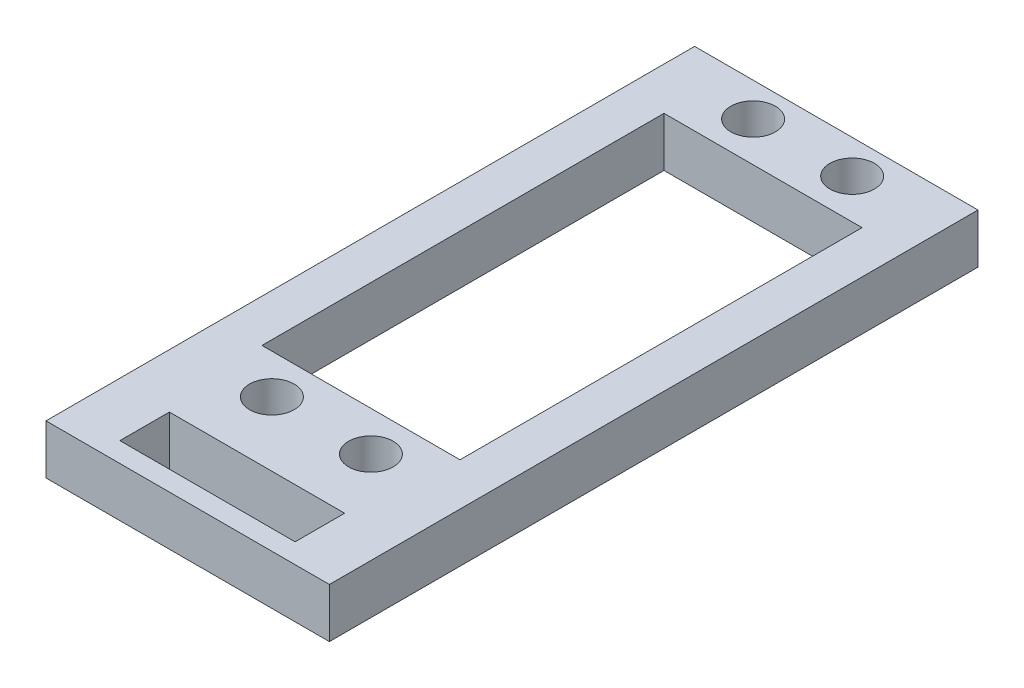
ISO-10303-21;
HEADER;
FILE_DESCRIPTION(('STEP AP214'),'2;1');
FILE_NAME('part.step','',(''),(''),'','','');
FILE_SCHEMA(('AUTOMOTIVE_DESIGN { 1 0 10303 214 1 1 1 1 }'));
ENDSEC;
DATA;
#1=APPLICATION_CONTEXT('core data for automotive mechanical design processes');
#2=APPLICATION_PROTOCOL_DEFINITION('international standard','automotive_design',2000,#1);
#3=PRODUCT_CONTEXT('',#1,'mechanical');
#4=PRODUCT('Part','Part','',(#3));
#5=PRODUCT_RELATED_PRODUCT_CATEGORY('part','',(#4));
#6=PRODUCT_DEFINITION_FORMATION('','',#4);
#7=PRODUCT_DEFINITION_CONTEXT('part definition',#1,'design');
#8=PRODUCT_DEFINITION('design','',#6,#7);
#9=PRODUCT_DEFINITION_SHAPE('','',#8);
#10=(LENGTH_UNIT() NAMED_UNIT(*) SI_UNIT(.MILLI.,.METRE.));
#11=(NAMED_UNIT(*) PLANE_ANGLE_UNIT() SI_UNIT($,.RADIAN.));
#12=(NAMED_UNIT(*) SI_UNIT($,.STERADIAN.) SOLID_ANGLE_UNIT());
#13=UNCERTAINTY_MEASURE_WITH_UNIT(LENGTH_MEASURE(1.E-05),#10,'distance_accuracy_value','');
#14=(GEOMETRIC_REPRESENTATION_CONTEXT(3) GLOBAL_UNCERTAINTY_ASSIGNED_CONTEXT((#13)) GLOBAL_UNIT_ASSIGNED_CONTEXT((#10,
#11,#12)) REPRESENTATION_CONTEXT('',''));
#15=CARTESIAN_POINT('',(0.,0.,0.));
#16=DIRECTION('',(0.,0.,1.));
#17=DIRECTION('',(1.,0.,0.));
#18=AXIS2_PLACEMENT_3D('',#15,#16,#17);
#19=CARTESIAN_POINT('',(0.,5.,0.));
#20=DIRECTION('',(0.,-1.,0.));
#21=DIRECTION('',(0.,0.,-1.));
#22=AXIS2_PLACEMENT_3D('',#19,#20,#21);
#23=PLANE('',#22);
#24=DIRECTION('',(0.,0.,1.));
#25=VECTOR('',#24,1.);
#26=CARTESIAN_POINT('',(0.,5.,0.));
#27=LINE('',#26,#25);
#28=CARTESIAN_POINT('',(0.,5.,0.));
#29=VERTEX_POINT('',#28);
#30=CARTESIAN_POINT('',(0.,5.,40.6));
#31=VERTEX_POINT('',#30);
#32=EDGE_CURVE('E161',#29,#31,#27,.T.);
#33=ORIENTED_EDGE('',*,*,#32,.F.);
#34=DIRECTION('',(-1.,0.,0.));
#35=VECTOR('',#34,1.);
#36=CARTESIAN_POINT('',(0.,5.,0.));
#37=LINE('',#36,#35);
#38=CARTESIAN_POINT('',(20.,5.,0.));
#39=VERTEX_POINT('',#38);
#40=EDGE_CURVE('E169',#39,#29,#37,.T.);
#41=ORIENTED_EDGE('',*,*,#40,.F.);
#42=DIRECTION('',(0.,0.,-1.));
#43=VECTOR('',#42,1.);
#44=CARTESIAN_POINT('',(20.,5.,0.));
#45=LINE('',#44,#43);
#46=CARTESIAN_POINT('',(20.,5.,40.6));
#47=VERTEX_POINT('',#46);
#48=EDGE_CURVE('E166',#47,#39,#45,.T.);
#49=ORIENTED_EDGE('',*,*,#48,.F.);
#50=DIRECTION('',(1.,0.,0.));
#51=VECTOR('',#50,1.);
#52=CARTESIAN_POINT('',(0.,5.,40.6));
#53=LINE('',#52,#51);
#54=EDGE_CURVE('E163',#31,#47,#53,.T.);
#55=ORIENTED_EDGE('',*,*,#54,.F.);
#56=EDGE_LOOP('',(#33,#41,#49,#55));
#57=FACE_BOUND('',#56,.T.);
#58=DIRECTION('',(0.,0.,-1.));
#59=VECTOR('',#58,1.);
#60=CARTESIAN_POINT('',(24.3088782061078,5.,48.));
#61=LINE('',#60,#59);
#62=CARTESIAN_POINT('',(24.3088782061078,5.,58.1));
#63=VERTEX_POINT('',#62);
#64=CARTESIAN_POINT('',(24.3088782061078,5.,-7.4));
#65=VERTEX_POINT('',#64);
#66=EDGE_CURVE('E192',#63,#65,#61,.T.);
#67=ORIENTED_EDGE('',*,*,#66,.T.);
#68=DIRECTION('',(-1.,0.,0.));
#69=VECTOR('',#68,1.);
#70=CARTESIAN_POINT('',(-4.30887820610779,5.,-7.4));
#71=LINE('',#70,#69);
#72=CARTESIAN_POINT('',(-4.30887820610779,5.,-7.4));
#73=VERTEX_POINT('',#72);
#74=EDGE_CURVE('E195',#65,#73,#71,.T.);
#75=ORIENTED_EDGE('',*,*,#74,.T.);
#76=DIRECTION('',(0.,0.,1.));
#77=VECTOR('',#76,1.);
#78=CARTESIAN_POINT('',(-4.30887820610779,5.,48.));
#79=LINE('',#78,#77);
#80=CARTESIAN_POINT('',(-4.30887820610779,5.,58.1));
#81=VERTEX_POINT('',#80);
#82=EDGE_CURVE('E198',#73,#81,#79,.T.);
#83=ORIENTED_EDGE('',*,*,#82,.T.);
#84=DIRECTION('',(1.,0.,0.));
#85=VECTOR('',#84,1.);
#86=CARTESIAN_POINT('',(-4.30887820610779,5.,58.1));
#87=LINE('',#86,#85);
#88=EDGE_CURVE('E200',#81,#63,#87,.T.);
#89=ORIENTED_EDGE('',*,*,#88,.T.);
#90=EDGE_LOOP('',(#67,#75,#83,#89));
#91=FACE_BOUND('',#90,.T.);
#92=DIRECTION('',(0.,0.,-1.));
#93=VECTOR('',#92,1.);
#94=CARTESIAN_POINT('',(18.848117925688,5.,56.1));
#95=LINE('',#94,#93);
#96=CARTESIAN_POINT('',(18.848117925688,5.,56.1));
#97=VERTEX_POINT('',#96);
#98=CARTESIAN_POINT('',(18.848117925688,5.,51.1));
#99=VERTEX_POINT('',#98);
#100=EDGE_CURVE('E122',#97,#99,#95,.T.);
#101=ORIENTED_EDGE('',*,*,#100,.F.);
#102=DIRECTION('',(1.,0.,0.));
#103=VECTOR('',#102,1.);
#104=CARTESIAN_POINT('',(1.15188207431199,5.,56.1));
#105=LINE('',#104,#103);
#106=CARTESIAN_POINT('',(1.15188207431199,5.,56.1));
#107=VERTEX_POINT('',#106);
#108=EDGE_CURVE('E145',#107,#97,#105,.T.);
#109=ORIENTED_EDGE('',*,*,#108,.F.);
#110=DIRECTION('',(0.,0.,1.));
#111=VECTOR('',#110,1.);
#112=CARTESIAN_POINT('',(1.15188207431199,5.,56.1));
#113=LINE('',#112,#111);
#114=CARTESIAN_POINT('',(1.15188207431199,5.,51.1));
#115=VERTEX_POINT('',#114);
#116=EDGE_CURVE('E143',#115,#107,#113,.T.);
#117=ORIENTED_EDGE('',*,*,#116,.F.);
#118=DIRECTION('',(-1.,0.,0.));
#119=VECTOR('',#118,1.);
#120=CARTESIAN_POINT('',(1.15188207431199,5.,51.1));
#121=LINE('',#120,#119);
#122=EDGE_CURVE('E130',#99,#115,#121,.T.);
#123=ORIENTED_EDGE('',*,*,#122,.F.);
#124=EDGE_LOOP('',(#101,#109,#117,#123));
#125=FACE_BOUND('',#124,.T.);
#126=CARTESIAN_POINT('',(5.,5.,-3.99999999999999));
#127=DIRECTION('',(0.,1.,0.));
#128=DIRECTION('',(0.,0.,1.));
#129=AXIS2_PLACEMENT_3D('',#126,#127,#128);
#130=CIRCLE('',#129,2.25);
#131=CARTESIAN_POINT('',(5.,5.,-1.74999999999999));
#132=VERTEX_POINT('',#131);
#133=EDGE_CURVE('E151',#132,#132,#130,.T.);
#134=ORIENTED_EDGE('',*,*,#133,.F.);
#135=EDGE_LOOP('',(#134));
#136=FACE_BOUND('',#135,.T.);
#137=CARTESIAN_POINT('',(15.,5.,-3.99999999999999));
#138=DIRECTION('',(0.,1.,0.));
#139=DIRECTION('',(0.,0.,-1.));
#140=AXIS2_PLACEMENT_3D('',#137,#138,#139);
#141=CIRCLE('',#140,2.25);
#142=CARTESIAN_POINT('',(15.,5.,-6.25));
#143=VERTEX_POINT('',#142);
#144=EDGE_CURVE('E424',#143,#143,#141,.T.);
#145=ORIENTED_EDGE('',*,*,#144,.F.);
#146=EDGE_LOOP('',(#145));
#147=FACE_BOUND('',#146,.T.);
#148=CARTESIAN_POINT('',(5.00000000000001,5.,44.6));
#149=DIRECTION('',(0.,1.,0.));
#150=DIRECTION('',(0.,0.,-1.));
#151=AXIS2_PLACEMENT_3D('',#148,#149,#150);
#152=CIRCLE('',#151,2.25);
#153=CARTESIAN_POINT('',(5.00000000000001,5.,42.35));
#154=VERTEX_POINT('',#153);
#155=EDGE_CURVE('E418',#154,#154,#152,.T.);
#156=ORIENTED_EDGE('',*,*,#155,.F.);
#157=EDGE_LOOP('',(#156));
#158=FACE_BOUND('',#157,.T.);
#159=CARTESIAN_POINT('',(15.,5.,44.6));
#160=DIRECTION('',(0.,1.,0.));
#161=DIRECTION('',(0.,0.,1.));
#162=AXIS2_PLACEMENT_3D('',#159,#160,#161);
#163=CIRCLE('',#162,2.25000000000001);
#164=CARTESIAN_POINT('',(15.,5.,46.85));
#165=VERTEX_POINT('',#164);
#166=EDGE_CURVE('E409',#165,#165,#163,.T.);
#167=ORIENTED_EDGE('',*,*,#166,.F.);
#168=EDGE_LOOP('',(#167));
#169=FACE_BOUND('',#168,.T.);
#170=ADVANCED_FACE('F33',(#57,#91,#125,#136,#147,#158,#169),#23,.F.);
#171=CARTESIAN_POINT('',(0.,0.,0.));
#172=DIRECTION('',(0.,-1.,0.));
#173=DIRECTION('',(0.,0.,-1.));
#174=AXIS2_PLACEMENT_3D('',#171,#172,#173);
#175=PLANE('',#174);
#176=CARTESIAN_POINT('',(5.00000000000001,0.,44.6));
#177=DIRECTION('',(0.,1.,0.));
#178=DIRECTION('',(0.,0.,-1.));
#179=AXIS2_PLACEMENT_3D('',#176,#177,#178);
#180=CIRCLE('',#179,2.25);
#181=CARTESIAN_POINT('',(5.00000000000001,0.,42.35));
#182=VERTEX_POINT('',#181);
#183=EDGE_CURVE('E415',#182,#182,#180,.T.);
#184=ORIENTED_EDGE('',*,*,#183,.T.);
#185=EDGE_LOOP('',(#184));
#186=FACE_BOUND('',#185,.T.);
#187=CARTESIAN_POINT('',(5.,0.,-3.99999999999999));
#188=DIRECTION('',(0.,1.,0.));
#189=DIRECTION('',(0.,0.,1.));
#190=AXIS2_PLACEMENT_3D('',#187,#188,#189);
#191=CIRCLE('',#190,2.25);
#192=CARTESIAN_POINT('',(5.,0.,-1.74999999999999));
#193=VERTEX_POINT('',#192);
#194=EDGE_CURVE('E427',#193,#193,#191,.T.);
#195=ORIENTED_EDGE('',*,*,#194,.T.);
#196=EDGE_LOOP('',(#195));
#197=FACE_BOUND('',#196,.T.);
#198=DIRECTION('',(-1.,0.,0.));
#199=VECTOR('',#198,1.);
#200=CARTESIAN_POINT('',(-4.30887820610779,0.,-7.4));
#201=LINE('',#200,#199);
#202=CARTESIAN_POINT('',(24.3088782061078,0.,-7.4));
#203=VERTEX_POINT('',#202);
#204=CARTESIAN_POINT('',(-4.30887820610779,0.,-7.4));
#205=VERTEX_POINT('',#204);
#206=EDGE_CURVE('E191',#203,#205,#201,.T.);
#207=ORIENTED_EDGE('',*,*,#206,.F.);
#208=DIRECTION('',(0.,0.,-1.));
#209=VECTOR('',#208,1.);
#210=CARTESIAN_POINT('',(24.3088782061078,0.,48.));
#211=LINE('',#210,#209);
#212=CARTESIAN_POINT('',(24.3088782061078,0.,58.1));
#213=VERTEX_POINT('',#212);
#214=EDGE_CURVE('E196',#213,#203,#211,.T.);
#215=ORIENTED_EDGE('',*,*,#214,.F.);
#216=DIRECTION('',(1.,0.,0.));
#217=VECTOR('',#216,1.);
#218=CARTESIAN_POINT('',(-4.30887820610779,0.,58.1));
#219=LINE('',#218,#217);
#220=CARTESIAN_POINT('',(-4.30887820610779,0.,58.1));
#221=VERTEX_POINT('',#220);
#222=EDGE_CURVE('E208',#221,#213,#219,.T.);
#223=ORIENTED_EDGE('',*,*,#222,.F.);
#224=DIRECTION('',(0.,0.,1.));
#225=VECTOR('',#224,1.);
#226=CARTESIAN_POINT('',(-4.30887820610779,0.,48.));
#227=LINE('',#226,#225);
#228=EDGE_CURVE('E206',#205,#221,#227,.T.);
#229=ORIENTED_EDGE('',*,*,#228,.F.);
#230=EDGE_LOOP('',(#207,#215,#223,#229));
#231=FACE_BOUND('',#230,.T.);
#232=DIRECTION('',(-1.,0.,0.));
#233=VECTOR('',#232,1.);
#234=CARTESIAN_POINT('',(0.,0.,0.));
#235=LINE('',#234,#233);
#236=CARTESIAN_POINT('',(20.,0.,0.));
#237=VERTEX_POINT('',#236);
#238=CARTESIAN_POINT('',(0.,0.,0.));
#239=VERTEX_POINT('',#238);
#240=EDGE_CURVE('E164',#237,#239,#235,.T.);
#241=ORIENTED_EDGE('',*,*,#240,.T.);
#242=DIRECTION('',(0.,0.,1.));
#243=VECTOR('',#242,1.);
#244=CARTESIAN_POINT('',(0.,0.,0.));
#245=LINE('',#244,#243);
#246=CARTESIAN_POINT('',(0.,0.,40.6));
#247=VERTEX_POINT('',#246);
#248=EDGE_CURVE('E138',#239,#247,#245,.T.);
#249=ORIENTED_EDGE('',*,*,#248,.T.);
#250=DIRECTION('',(1.,0.,0.));
#251=VECTOR('',#250,1.);
#252=CARTESIAN_POINT('',(0.,0.,40.6));
#253=LINE('',#252,#251);
#254=CARTESIAN_POINT('',(20.,0.,40.6));
#255=VERTEX_POINT('',#254);
#256=EDGE_CURVE('E174',#247,#255,#253,.T.);
#257=ORIENTED_EDGE('',*,*,#256,.T.);
#258=DIRECTION('',(0.,0.,-1.));
#259=VECTOR('',#258,1.);
#260=CARTESIAN_POINT('',(20.,0.,0.));
#261=LINE('',#260,#259);
#262=EDGE_CURVE('E177',#255,#237,#261,.T.);
#263=ORIENTED_EDGE('',*,*,#262,.T.);
#264=EDGE_LOOP('',(#241,#249,#257,#263));
#265=FACE_BOUND('',#264,.T.);
#266=DIRECTION('',(1.,0.,0.));
#267=VECTOR('',#266,1.);
#268=CARTESIAN_POINT('',(1.15188207431199,0.,56.1));
#269=LINE('',#268,#267);
#270=CARTESIAN_POINT('',(1.15188207431199,0.,56.1));
#271=VERTEX_POINT('',#270);
#272=CARTESIAN_POINT('',(18.848117925688,0.,56.1));
#273=VERTEX_POINT('',#272);
#274=EDGE_CURVE('E131',#271,#273,#269,.T.);
#275=ORIENTED_EDGE('',*,*,#274,.T.);
#276=DIRECTION('',(0.,0.,-1.));
#277=VECTOR('',#276,1.);
#278=CARTESIAN_POINT('',(18.848117925688,0.,56.1));
#279=LINE('',#278,#277);
#280=CARTESIAN_POINT('',(18.848117925688,0.,51.1));
#281=VERTEX_POINT('',#280);
#282=EDGE_CURVE('E56',#273,#281,#279,.T.);
#283=ORIENTED_EDGE('',*,*,#282,.T.);
#284=DIRECTION('',(-1.,0.,0.));
#285=VECTOR('',#284,1.);
#286=CARTESIAN_POINT('',(1.15188207431199,0.,51.1));
#287=LINE('',#286,#285);
#288=CARTESIAN_POINT('',(1.15188207431199,0.,51.1));
#289=VERTEX_POINT('',#288);
#290=EDGE_CURVE('E137',#281,#289,#287,.T.);
#291=ORIENTED_EDGE('',*,*,#290,.T.);
#292=DIRECTION('',(0.,0.,1.));
#293=VECTOR('',#292,1.);
#294=CARTESIAN_POINT('',(1.15188207431199,0.,56.1));
#295=LINE('',#294,#293);
#296=EDGE_CURVE('E153',#289,#271,#295,.T.);
#297=ORIENTED_EDGE('',*,*,#296,.T.);
#298=EDGE_LOOP('',(#275,#283,#291,#297));
#299=FACE_BOUND('',#298,.T.);
#300=CARTESIAN_POINT('',(15.,0.,-3.99999999999999));
#301=DIRECTION('',(0.,1.,0.));
#302=DIRECTION('',(0.,0.,-1.));
#303=AXIS2_PLACEMENT_3D('',#300,#301,#302);
#304=CIRCLE('',#303,2.25);
#305=CARTESIAN_POINT('',(15.,0.,-6.25));
#306=VERTEX_POINT('',#305);
#307=EDGE_CURVE('E421',#306,#306,#304,.T.);
#308=ORIENTED_EDGE('',*,*,#307,.T.);
#309=EDGE_LOOP('',(#308));
#310=FACE_BOUND('',#309,.T.);
#311=CARTESIAN_POINT('',(15.,0.,44.6));
#312=DIRECTION('',(0.,1.,0.));
#313=DIRECTION('',(0.,0.,1.));
#314=AXIS2_PLACEMENT_3D('',#311,#312,#313);
#315=CIRCLE('',#314,2.25000000000001);
#316=CARTESIAN_POINT('',(15.,0.,46.85));
#317=VERTEX_POINT('',#316);
#318=EDGE_CURVE('E412',#317,#317,#315,.T.);
#319=ORIENTED_EDGE('',*,*,#318,.T.);
#320=EDGE_LOOP('',(#319));
#321=FACE_BOUND('',#320,.T.);
#322=ADVANCED_FACE('F226',(#186,#197,#231,#265,#299,#310,#321),#175,.T.);
#323=CARTESIAN_POINT('',(-4.30887820610779,5.,-7.4));
#324=DIRECTION('',(0.,0.,1.));
#325=DIRECTION('',(1.,0.,0.));
#326=AXIS2_PLACEMENT_3D('',#323,#324,#325);
#327=PLANE('',#326);
#328=ORIENTED_EDGE('',*,*,#206,.T.);
#329=DIRECTION('',(0.,-1.,0.));
#330=VECTOR('',#329,1.);
#331=CARTESIAN_POINT('',(-4.30887820610779,5.,-7.4));
#332=LINE('',#331,#330);
#333=EDGE_CURVE('E41',#73,#205,#332,.T.);
#334=ORIENTED_EDGE('',*,*,#333,.F.);
#335=ORIENTED_EDGE('',*,*,#74,.F.);
#336=DIRECTION('',(0.,-1.,0.));
#337=VECTOR('',#336,1.);
#338=CARTESIAN_POINT('',(24.3088782061078,5.,-7.4));
#339=LINE('',#338,#337);
#340=EDGE_CURVE('E11',#65,#203,#339,.T.);
#341=ORIENTED_EDGE('',*,*,#340,.T.);
#342=EDGE_LOOP('',(#328,#334,#335,#341));
#343=FACE_BOUND('',#342,.T.);
#344=ADVANCED_FACE('F35',(#343),#327,.F.);
#345=CARTESIAN_POINT('',(-4.30887820610779,5.,48.));
#346=DIRECTION('',(1.,0.,0.));
#347=DIRECTION('',(0.,0.,-1.));
#348=AXIS2_PLACEMENT_3D('',#345,#346,#347);
#349=PLANE('',#348);
#350=ORIENTED_EDGE('',*,*,#228,.T.);
#351=DIRECTION('',(0.,-1.,0.));
#352=VECTOR('',#351,1.);
#353=CARTESIAN_POINT('',(-4.30887820610779,5.,58.1));
#354=LINE('',#353,#352);
#355=EDGE_CURVE('E213',#81,#221,#354,.T.);
#356=ORIENTED_EDGE('',*,*,#355,.F.);
#357=ORIENTED_EDGE('',*,*,#82,.F.);
#358=ORIENTED_EDGE('',*,*,#333,.T.);
#359=EDGE_LOOP('',(#350,#356,#357,#358));
#360=FACE_BOUND('',#359,.T.);
#361=ADVANCED_FACE('F219',(#360),#349,.F.);
#362=CARTESIAN_POINT('',(-4.30887820610779,5.,58.1));
#363=DIRECTION('',(0.,0.,-1.));
#364=DIRECTION('',(-1.,0.,0.));
#365=AXIS2_PLACEMENT_3D('',#362,#363,#364);
#366=PLANE('',#365);
#367=ORIENTED_EDGE('',*,*,#222,.T.);
#368=DIRECTION('',(0.,-1.,0.));
#369=VECTOR('',#368,1.);
#370=CARTESIAN_POINT('',(24.3088782061078,5.,58.1));
#371=LINE('',#370,#369);
#372=EDGE_CURVE('E203',#63,#213,#371,.T.);
#373=ORIENTED_EDGE('',*,*,#372,.F.);
#374=ORIENTED_EDGE('',*,*,#88,.F.);
#375=ORIENTED_EDGE('',*,*,#355,.T.);
#376=EDGE_LOOP('',(#367,#373,#374,#375));
#377=FACE_BOUND('',#376,.T.);
#378=ADVANCED_FACE('F231',(#377),#366,.F.);
#379=CARTESIAN_POINT('',(24.3088782061078,5.,48.));
#380=DIRECTION('',(-1.,0.,0.));
#381=DIRECTION('',(0.,0.,1.));
#382=AXIS2_PLACEMENT_3D('',#379,#380,#381);
#383=PLANE('',#382);
#384=ORIENTED_EDGE('',*,*,#214,.T.);
#385=ORIENTED_EDGE('',*,*,#340,.F.);
#386=ORIENTED_EDGE('',*,*,#66,.F.);
#387=ORIENTED_EDGE('',*,*,#372,.T.);
#388=EDGE_LOOP('',(#384,#385,#386,#387));
#389=FACE_BOUND('',#388,.T.);
#390=ADVANCED_FACE('F234',(#389),#383,.F.);
#391=CARTESIAN_POINT('',(0.,5.,0.));
#392=DIRECTION('',(1.,0.,0.));
#393=DIRECTION('',(0.,0.,-1.));
#394=AXIS2_PLACEMENT_3D('',#391,#392,#393);
#395=PLANE('',#394);
#396=ORIENTED_EDGE('',*,*,#248,.F.);
#397=DIRECTION('',(0.,-1.,0.));
#398=VECTOR('',#397,1.);
#399=CARTESIAN_POINT('',(0.,5.,0.));
#400=LINE('',#399,#398);
#401=EDGE_CURVE('E171',#29,#239,#400,.T.);
#402=ORIENTED_EDGE('',*,*,#401,.F.);
#403=ORIENTED_EDGE('',*,*,#32,.T.);
#404=DIRECTION('',(0.,-1.,0.));
#405=VECTOR('',#404,1.);
#406=CARTESIAN_POINT('',(0.,5.,40.6));
#407=LINE('',#406,#405);
#408=EDGE_CURVE('E188',#31,#247,#407,.T.);
#409=ORIENTED_EDGE('',*,*,#408,.T.);
#410=EDGE_LOOP('',(#396,#402,#403,#409));
#411=FACE_BOUND('',#410,.T.);
#412=ADVANCED_FACE('F246',(#411),#395,.T.);
#413=CARTESIAN_POINT('',(0.,5.,40.6));
#414=DIRECTION('',(0.,0.,-1.));
#415=DIRECTION('',(-1.,0.,0.));
#416=AXIS2_PLACEMENT_3D('',#413,#414,#415);
#417=PLANE('',#416);
#418=ORIENTED_EDGE('',*,*,#256,.F.);
#419=ORIENTED_EDGE('',*,*,#408,.F.);
#420=ORIENTED_EDGE('',*,*,#54,.T.);
#421=DIRECTION('',(0.,-1.,0.));
#422=VECTOR('',#421,1.);
#423=CARTESIAN_POINT('',(20.,5.,40.6));
#424=LINE('',#423,#422);
#425=EDGE_CURVE('E186',#47,#255,#424,.T.);
#426=ORIENTED_EDGE('',*,*,#425,.T.);
#427=EDGE_LOOP('',(#418,#419,#420,#426));
#428=FACE_BOUND('',#427,.T.);
#429=ADVANCED_FACE('F298',(#428),#417,.T.);
#430=CARTESIAN_POINT('',(20.,5.,0.));
#431=DIRECTION('',(-1.,0.,0.));
#432=DIRECTION('',(0.,0.,1.));
#433=AXIS2_PLACEMENT_3D('',#430,#431,#432);
#434=PLANE('',#433);
#435=ORIENTED_EDGE('',*,*,#262,.F.);
#436=ORIENTED_EDGE('',*,*,#425,.F.);
#437=ORIENTED_EDGE('',*,*,#48,.T.);
#438=DIRECTION('',(0.,-1.,0.));
#439=VECTOR('',#438,1.);
#440=CARTESIAN_POINT('',(20.,5.,0.));
#441=LINE('',#440,#439);
#442=EDGE_CURVE('E184',#39,#237,#441,.T.);
#443=ORIENTED_EDGE('',*,*,#442,.T.);
#444=EDGE_LOOP('',(#435,#436,#437,#443));
#445=FACE_BOUND('',#444,.T.);
#446=ADVANCED_FACE('F306',(#445),#434,.T.);
#447=CARTESIAN_POINT('',(0.,5.,0.));
#448=DIRECTION('',(0.,0.,1.));
#449=DIRECTION('',(1.,0.,0.));
#450=AXIS2_PLACEMENT_3D('',#447,#448,#449);
#451=PLANE('',#450);
#452=ORIENTED_EDGE('',*,*,#240,.F.);
#453=ORIENTED_EDGE('',*,*,#442,.F.);
#454=ORIENTED_EDGE('',*,*,#40,.T.);
#455=ORIENTED_EDGE('',*,*,#401,.T.);
#456=EDGE_LOOP('',(#452,#453,#454,#455));
#457=FACE_BOUND('',#456,.T.);
#458=ADVANCED_FACE('F314',(#457),#451,.T.);
#459=CARTESIAN_POINT('',(18.848117925688,5.,56.1));
#460=DIRECTION('',(-1.,0.,0.));
#461=DIRECTION('',(0.,0.,1.));
#462=AXIS2_PLACEMENT_3D('',#459,#460,#461);
#463=PLANE('',#462);
#464=ORIENTED_EDGE('',*,*,#282,.F.);
#465=DIRECTION('',(0.,-1.,0.));
#466=VECTOR('',#465,1.);
#467=CARTESIAN_POINT('',(18.848117925688,5.,56.1));
#468=LINE('',#467,#466);
#469=EDGE_CURVE('E126',#97,#273,#468,.T.);
#470=ORIENTED_EDGE('',*,*,#469,.F.);
#471=ORIENTED_EDGE('',*,*,#100,.T.);
#472=DIRECTION('',(0.,-1.,0.));
#473=VECTOR('',#472,1.);
#474=CARTESIAN_POINT('',(18.848117925688,5.,51.1));
#475=LINE('',#474,#473);
#476=EDGE_CURVE('E125',#99,#281,#475,.T.);
#477=ORIENTED_EDGE('',*,*,#476,.T.);
#478=EDGE_LOOP('',(#464,#470,#471,#477));
#479=FACE_BOUND('',#478,.T.);
#480=ADVANCED_FACE('F124',(#479),#463,.T.);
#481=CARTESIAN_POINT('',(1.15188207431199,5.,51.1));
#482=DIRECTION('',(0.,0.,1.));
#483=DIRECTION('',(1.,0.,0.));
#484=AXIS2_PLACEMENT_3D('',#481,#482,#483);
#485=PLANE('',#484);
#486=ORIENTED_EDGE('',*,*,#290,.F.);
#487=ORIENTED_EDGE('',*,*,#476,.F.);
#488=ORIENTED_EDGE('',*,*,#122,.T.);
#489=DIRECTION('',(0.,-1.,0.));
#490=VECTOR('',#489,1.);
#491=CARTESIAN_POINT('',(1.15188207431199,5.,51.1));
#492=LINE('',#491,#490);
#493=EDGE_CURVE('E139',#115,#289,#492,.T.);
#494=ORIENTED_EDGE('',*,*,#493,.T.);
#495=EDGE_LOOP('',(#486,#487,#488,#494));
#496=FACE_BOUND('',#495,.T.);
#497=ADVANCED_FACE('F134',(#496),#485,.T.);
#498=CARTESIAN_POINT('',(1.15188207431199,5.,56.1));
#499=DIRECTION('',(1.,0.,0.));
#500=DIRECTION('',(0.,0.,-1.));
#501=AXIS2_PLACEMENT_3D('',#498,#499,#500);
#502=PLANE('',#501);
#503=ORIENTED_EDGE('',*,*,#296,.F.);
#504=ORIENTED_EDGE('',*,*,#493,.F.);
#505=ORIENTED_EDGE('',*,*,#116,.T.);
#506=DIRECTION('',(0.,-1.,0.));
#507=VECTOR('',#506,1.);
#508=CARTESIAN_POINT('',(1.15188207431199,5.,56.1));
#509=LINE('',#508,#507);
#510=EDGE_CURVE('E48',#107,#271,#509,.T.);
#511=ORIENTED_EDGE('',*,*,#510,.T.);
#512=EDGE_LOOP('',(#503,#504,#505,#511));
#513=FACE_BOUND('',#512,.T.);
#514=ADVANCED_FACE('F338',(#513),#502,.T.);
#515=CARTESIAN_POINT('',(1.15188207431199,5.,56.1));
#516=DIRECTION('',(0.,0.,-1.));
#517=DIRECTION('',(-1.,0.,0.));
#518=AXIS2_PLACEMENT_3D('',#515,#516,#517);
#519=PLANE('',#518);
#520=ORIENTED_EDGE('',*,*,#274,.F.);
#521=ORIENTED_EDGE('',*,*,#510,.F.);
#522=ORIENTED_EDGE('',*,*,#108,.T.);
#523=ORIENTED_EDGE('',*,*,#469,.T.);
#524=EDGE_LOOP('',(#520,#521,#522,#523));
#525=FACE_BOUND('',#524,.T.);
#526=ADVANCED_FACE('F346',(#525),#519,.T.);
#527=CARTESIAN_POINT('',(5.,5.,-3.99999999999999));
#528=DIRECTION('',(0.,-1.,0.));
#529=DIRECTION('',(0.,0.,-1.));
#530=AXIS2_PLACEMENT_3D('',#527,#528,#529);
#531=CYLINDRICAL_SURFACE('',#530,2.25);
#532=ORIENTED_EDGE('',*,*,#133,.T.);
#533=EDGE_LOOP('',(#532));
#534=FACE_BOUND('',#533,.T.);
#535=ORIENTED_EDGE('',*,*,#194,.F.);
#536=EDGE_LOOP('',(#535));
#537=FACE_BOUND('',#536,.T.);
#538=ADVANCED_FACE('F355',(#534,#537),#531,.F.);
#539=CARTESIAN_POINT('',(15.,5.,-3.99999999999999));
#540=DIRECTION('',(0.,-1.,0.));
#541=DIRECTION('',(0.,0.,-1.));
#542=AXIS2_PLACEMENT_3D('',#539,#540,#541);
#543=CYLINDRICAL_SURFACE('',#542,2.25);
#544=ORIENTED_EDGE('',*,*,#144,.T.);
#545=EDGE_LOOP('',(#544));
#546=FACE_BOUND('',#545,.T.);
#547=ORIENTED_EDGE('',*,*,#307,.F.);
#548=EDGE_LOOP('',(#547));
#549=FACE_BOUND('',#548,.T.);
#550=ADVANCED_FACE('F363',(#546,#549),#543,.F.);
#551=CARTESIAN_POINT('',(5.00000000000001,5.,44.6));
#552=DIRECTION('',(0.,-1.,0.));
#553=DIRECTION('',(0.,0.,-1.));
#554=AXIS2_PLACEMENT_3D('',#551,#552,#553);
#555=CYLINDRICAL_SURFACE('',#554,2.25);
#556=ORIENTED_EDGE('',*,*,#155,.T.);
#557=EDGE_LOOP('',(#556));
#558=FACE_BOUND('',#557,.T.);
#559=ORIENTED_EDGE('',*,*,#183,.F.);
#560=EDGE_LOOP('',(#559));
#561=FACE_BOUND('',#560,.T.);
#562=ADVANCED_FACE('F372',(#558,#561),#555,.F.);
#563=CARTESIAN_POINT('',(15.,5.,44.6));
#564=DIRECTION('',(0.,-1.,0.));
#565=DIRECTION('',(0.,0.,-1.));
#566=AXIS2_PLACEMENT_3D('',#563,#564,#565);
#567=CYLINDRICAL_SURFACE('',#566,2.25000000000001);
#568=ORIENTED_EDGE('',*,*,#166,.T.);
#569=EDGE_LOOP('',(#568));
#570=FACE_BOUND('',#569,.T.);
#571=ORIENTED_EDGE('',*,*,#318,.F.);
#572=EDGE_LOOP('',(#571));
#573=FACE_BOUND('',#572,.T.);
#574=ADVANCED_FACE('F381',(#570,#573),#567,.F.);
#575=CLOSED_SHELL('',(#170,#322,#344,#361,#378,#390,#412,#429,#446,#458,#480,#497,#514,#526,
#538,#550,#562,#574));
#576=MANIFOLD_SOLID_BREP('B2',#575);
#577=ADVANCED_BREP_SHAPE_REPRESENTATION('',(#18,#576),#14);
#578=SHAPE_DEFINITION_REPRESENTATION(#9,#577);
ENDSEC;
END-ISO-10303-21;
